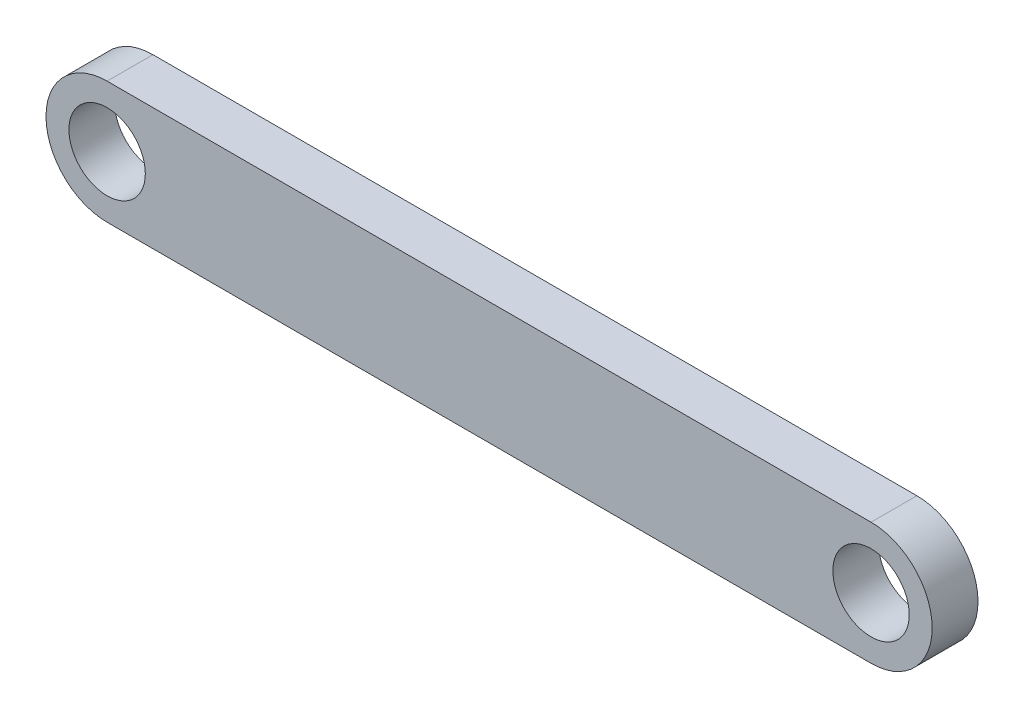
ISO-10303-21;
HEADER;
FILE_DESCRIPTION(('STEP AP214'),'2;1');
FILE_NAME('part.step','',(''),(''),'','','');
FILE_SCHEMA(('AUTOMOTIVE_DESIGN { 1 0 10303 214 1 1 1 1 }'));
ENDSEC;
DATA;
#1=APPLICATION_CONTEXT('core data for automotive mechanical design processes');
#2=APPLICATION_PROTOCOL_DEFINITION('international standard','automotive_design',2000,#1);
#3=PRODUCT_CONTEXT('',#1,'mechanical');
#4=PRODUCT('Part','Part','',(#3));
#5=PRODUCT_RELATED_PRODUCT_CATEGORY('part','',(#4));
#6=PRODUCT_DEFINITION_FORMATION('','',#4);
#7=PRODUCT_DEFINITION_CONTEXT('part definition',#1,'design');
#8=PRODUCT_DEFINITION('design','',#6,#7);
#9=PRODUCT_DEFINITION_SHAPE('','',#8);
#10=(LENGTH_UNIT() NAMED_UNIT(*) SI_UNIT(.MILLI.,.METRE.));
#11=(NAMED_UNIT(*) PLANE_ANGLE_UNIT() SI_UNIT($,.RADIAN.));
#12=(NAMED_UNIT(*) SI_UNIT($,.STERADIAN.) SOLID_ANGLE_UNIT());
#13=UNCERTAINTY_MEASURE_WITH_UNIT(LENGTH_MEASURE(1.E-05),#10,'distance_accuracy_value','');
#14=(GEOMETRIC_REPRESENTATION_CONTEXT(3) GLOBAL_UNCERTAINTY_ASSIGNED_CONTEXT((#13)) GLOBAL_UNIT_ASSIGNED_CONTEXT((#10,
#11,#12)) REPRESENTATION_CONTEXT('',''));
#15=CARTESIAN_POINT('',(0.,0.,0.));
#16=DIRECTION('',(0.,0.,1.));
#17=DIRECTION('',(1.,0.,0.));
#18=AXIS2_PLACEMENT_3D('',#15,#16,#17);
#19=CARTESIAN_POINT('',(0.,0.,3.));
#20=DIRECTION('',(0.,0.,1.));
#21=DIRECTION('',(1.,0.,0.));
#22=AXIS2_PLACEMENT_3D('',#19,#20,#21);
#23=PLANE('',#22);
#24=CARTESIAN_POINT('',(-50.,0.,3.));
#25=DIRECTION('',(0.,0.,1.));
#26=DIRECTION('',(1.,0.,0.));
#27=AXIS2_PLACEMENT_3D('',#24,#25,#26);
#28=CIRCLE('',#27,2.5);
#29=CARTESIAN_POINT('',(-47.5,0.,3.));
#30=VERTEX_POINT('',#29);
#31=EDGE_CURVE('E101',#30,#30,#28,.T.);
#32=ORIENTED_EDGE('',*,*,#31,.F.);
#33=EDGE_LOOP('',(#32));
#34=FACE_BOUND('',#33,.T.);
#35=CARTESIAN_POINT('',(0.,0.,3.));
#36=DIRECTION('',(0.,0.,1.));
#37=DIRECTION('',(1.,0.,0.));
#38=AXIS2_PLACEMENT_3D('',#35,#36,#37);
#39=CIRCLE('',#38,4.);
#40=CARTESIAN_POINT('',(0.,-4.,3.));
#41=VERTEX_POINT('',#40);
#42=CARTESIAN_POINT('',(0.,4.,3.));
#43=VERTEX_POINT('',#42);
#44=EDGE_CURVE('E86',#41,#43,#39,.T.);
#45=ORIENTED_EDGE('',*,*,#44,.T.);
#46=DIRECTION('',(-1.,0.,0.));
#47=VECTOR('',#46,1.);
#48=CARTESIAN_POINT('',(-50.,3.99999999999999,3.));
#49=LINE('',#48,#47);
#50=CARTESIAN_POINT('',(-50.,3.99999999999999,3.));
#51=VERTEX_POINT('',#50);
#52=EDGE_CURVE('E81',#43,#51,#49,.T.);
#53=ORIENTED_EDGE('',*,*,#52,.T.);
#54=CARTESIAN_POINT('',(-50.,0.,3.));
#55=DIRECTION('',(0.,0.,1.));
#56=DIRECTION('',(1.,0.,0.));
#57=AXIS2_PLACEMENT_3D('',#54,#55,#56);
#58=CIRCLE('',#57,4.);
#59=CARTESIAN_POINT('',(-50.,-4.00000000000001,3.));
#60=VERTEX_POINT('',#59);
#61=EDGE_CURVE('E84',#51,#60,#58,.T.);
#62=ORIENTED_EDGE('',*,*,#61,.T.);
#63=DIRECTION('',(1.,0.,0.));
#64=VECTOR('',#63,1.);
#65=CARTESIAN_POINT('',(-50.,-4.00000000000001,3.));
#66=LINE('',#65,#64);
#67=EDGE_CURVE('E51',#60,#41,#66,.T.);
#68=ORIENTED_EDGE('',*,*,#67,.T.);
#69=EDGE_LOOP('',(#45,#53,#62,#68));
#70=FACE_BOUND('',#69,.T.);
#71=CARTESIAN_POINT('',(0.,0.,3.));
#72=DIRECTION('',(0.,0.,1.));
#73=DIRECTION('',(1.,0.,0.));
#74=AXIS2_PLACEMENT_3D('',#71,#72,#73);
#75=CIRCLE('',#74,2.5);
#76=CARTESIAN_POINT('',(2.5,0.,3.));
#77=VERTEX_POINT('',#76);
#78=EDGE_CURVE('E116',#77,#77,#75,.T.);
#79=ORIENTED_EDGE('',*,*,#78,.F.);
#80=EDGE_LOOP('',(#79));
#81=FACE_BOUND('',#80,.T.);
#82=ADVANCED_FACE('F34',(#34,#70,#81),#23,.T.);
#83=CARTESIAN_POINT('',(0.,0.,0.));
#84=DIRECTION('',(0.,0.,1.));
#85=DIRECTION('',(1.,0.,0.));
#86=AXIS2_PLACEMENT_3D('',#83,#84,#85);
#87=PLANE('',#86);
#88=CARTESIAN_POINT('',(0.,0.,0.));
#89=DIRECTION('',(0.,0.,1.));
#90=DIRECTION('',(1.,0.,0.));
#91=AXIS2_PLACEMENT_3D('',#88,#89,#90);
#92=CIRCLE('',#91,4.);
#93=CARTESIAN_POINT('',(0.,-4.,0.));
#94=VERTEX_POINT('',#93);
#95=CARTESIAN_POINT('',(0.,4.,0.));
#96=VERTEX_POINT('',#95);
#97=EDGE_CURVE('E98',#94,#96,#92,.T.);
#98=ORIENTED_EDGE('',*,*,#97,.F.);
#99=DIRECTION('',(1.,0.,0.));
#100=VECTOR('',#99,1.);
#101=CARTESIAN_POINT('',(-50.,-4.00000000000001,0.));
#102=LINE('',#101,#100);
#103=CARTESIAN_POINT('',(-50.,-4.00000000000001,0.));
#104=VERTEX_POINT('',#103);
#105=EDGE_CURVE('E74',#104,#94,#102,.T.);
#106=ORIENTED_EDGE('',*,*,#105,.F.);
#107=CARTESIAN_POINT('',(-50.,0.,0.));
#108=DIRECTION('',(0.,0.,1.));
#109=DIRECTION('',(1.,0.,0.));
#110=AXIS2_PLACEMENT_3D('',#107,#108,#109);
#111=CIRCLE('',#110,4.);
#112=CARTESIAN_POINT('',(-50.,3.99999999999999,0.));
#113=VERTEX_POINT('',#112);
#114=EDGE_CURVE('E68',#113,#104,#111,.T.);
#115=ORIENTED_EDGE('',*,*,#114,.F.);
#116=DIRECTION('',(-1.,0.,0.));
#117=VECTOR('',#116,1.);
#118=CARTESIAN_POINT('',(-50.,3.99999999999999,0.));
#119=LINE('',#118,#117);
#120=EDGE_CURVE('E90',#96,#113,#119,.T.);
#121=ORIENTED_EDGE('',*,*,#120,.F.);
#122=EDGE_LOOP('',(#98,#106,#115,#121));
#123=FACE_BOUND('',#122,.T.);
#124=CARTESIAN_POINT('',(-50.,0.,0.));
#125=DIRECTION('',(0.,0.,1.));
#126=DIRECTION('',(1.,0.,0.));
#127=AXIS2_PLACEMENT_3D('',#124,#125,#126);
#128=CIRCLE('',#127,2.5);
#129=CARTESIAN_POINT('',(-47.5,0.,0.));
#130=VERTEX_POINT('',#129);
#131=EDGE_CURVE('E113',#130,#130,#128,.T.);
#132=ORIENTED_EDGE('',*,*,#131,.T.);
#133=EDGE_LOOP('',(#132));
#134=FACE_BOUND('',#133,.T.);
#135=CARTESIAN_POINT('',(0.,0.,0.));
#136=DIRECTION('',(0.,0.,1.));
#137=DIRECTION('',(1.,0.,0.));
#138=AXIS2_PLACEMENT_3D('',#135,#136,#137);
#139=CIRCLE('',#138,2.5);
#140=CARTESIAN_POINT('',(2.5,0.,0.));
#141=VERTEX_POINT('',#140);
#142=EDGE_CURVE('E119',#141,#141,#139,.T.);
#143=ORIENTED_EDGE('',*,*,#142,.T.);
#144=EDGE_LOOP('',(#143));
#145=FACE_BOUND('',#144,.T.);
#146=ADVANCED_FACE('F109',(#123,#134,#145),#87,.F.);
#147=CARTESIAN_POINT('',(0.,0.,3.));
#148=DIRECTION('',(0.,0.,-1.));
#149=DIRECTION('',(-1.,0.,0.));
#150=AXIS2_PLACEMENT_3D('',#147,#148,#149);
#151=CYLINDRICAL_SURFACE('',#150,4.);
#152=ORIENTED_EDGE('',*,*,#97,.T.);
#153=DIRECTION('',(0.,0.,-1.));
#154=VECTOR('',#153,1.);
#155=CARTESIAN_POINT('',(0.,4.,3.));
#156=LINE('',#155,#154);
#157=EDGE_CURVE('E11',#43,#96,#156,.T.);
#158=ORIENTED_EDGE('',*,*,#157,.F.);
#159=ORIENTED_EDGE('',*,*,#44,.F.);
#160=DIRECTION('',(0.,0.,-1.));
#161=VECTOR('',#160,1.);
#162=CARTESIAN_POINT('',(0.,-4.,3.));
#163=LINE('',#162,#161);
#164=EDGE_CURVE('E94',#41,#94,#163,.T.);
#165=ORIENTED_EDGE('',*,*,#164,.T.);
#166=EDGE_LOOP('',(#152,#158,#159,#165));
#167=FACE_BOUND('',#166,.T.);
#168=ADVANCED_FACE('F36',(#167),#151,.T.);
#169=CARTESIAN_POINT('',(-50.,3.99999999999999,3.));
#170=DIRECTION('',(0.,-1.,0.));
#171=DIRECTION('',(1.,0.,0.));
#172=AXIS2_PLACEMENT_3D('',#169,#170,#171);
#173=PLANE('',#172);
#174=ORIENTED_EDGE('',*,*,#120,.T.);
#175=DIRECTION('',(0.,0.,-1.));
#176=VECTOR('',#175,1.);
#177=CARTESIAN_POINT('',(-50.,3.99999999999999,3.));
#178=LINE('',#177,#176);
#179=EDGE_CURVE('E43',#51,#113,#178,.T.);
#180=ORIENTED_EDGE('',*,*,#179,.F.);
#181=ORIENTED_EDGE('',*,*,#52,.F.);
#182=ORIENTED_EDGE('',*,*,#157,.T.);
#183=EDGE_LOOP('',(#174,#180,#181,#182));
#184=FACE_BOUND('',#183,.T.);
#185=ADVANCED_FACE('F89',(#184),#173,.F.);
#186=CARTESIAN_POINT('',(-50.,0.,3.));
#187=DIRECTION('',(0.,0.,-1.));
#188=DIRECTION('',(-1.,0.,0.));
#189=AXIS2_PLACEMENT_3D('',#186,#187,#188);
#190=CYLINDRICAL_SURFACE('',#189,4.);
#191=ORIENTED_EDGE('',*,*,#114,.T.);
#192=DIRECTION('',(0.,0.,-1.));
#193=VECTOR('',#192,1.);
#194=CARTESIAN_POINT('',(-50.,-4.00000000000001,3.));
#195=LINE('',#194,#193);
#196=EDGE_CURVE('E91',#60,#104,#195,.T.);
#197=ORIENTED_EDGE('',*,*,#196,.F.);
#198=ORIENTED_EDGE('',*,*,#61,.F.);
#199=ORIENTED_EDGE('',*,*,#179,.T.);
#200=EDGE_LOOP('',(#191,#197,#198,#199));
#201=FACE_BOUND('',#200,.T.);
#202=ADVANCED_FACE('F92',(#201),#190,.T.);
#203=CARTESIAN_POINT('',(-50.,-4.00000000000001,3.));
#204=DIRECTION('',(0.,1.,0.));
#205=DIRECTION('',(-1.,0.,0.));
#206=AXIS2_PLACEMENT_3D('',#203,#204,#205);
#207=PLANE('',#206);
#208=ORIENTED_EDGE('',*,*,#105,.T.);
#209=ORIENTED_EDGE('',*,*,#164,.F.);
#210=ORIENTED_EDGE('',*,*,#67,.F.);
#211=ORIENTED_EDGE('',*,*,#196,.T.);
#212=EDGE_LOOP('',(#208,#209,#210,#211));
#213=FACE_BOUND('',#212,.T.);
#214=ADVANCED_FACE('F106',(#213),#207,.F.);
#215=CARTESIAN_POINT('',(-50.,0.,3.));
#216=DIRECTION('',(0.,0.,-1.));
#217=DIRECTION('',(-1.,0.,0.));
#218=AXIS2_PLACEMENT_3D('',#215,#216,#217);
#219=CYLINDRICAL_SURFACE('',#218,2.5);
#220=ORIENTED_EDGE('',*,*,#31,.T.);
#221=EDGE_LOOP('',(#220));
#222=FACE_BOUND('',#221,.T.);
#223=ORIENTED_EDGE('',*,*,#131,.F.);
#224=EDGE_LOOP('',(#223));
#225=FACE_BOUND('',#224,.T.);
#226=ADVANCED_FACE('F136',(#222,#225),#219,.F.);
#227=CARTESIAN_POINT('',(0.,0.,3.));
#228=DIRECTION('',(0.,0.,-1.));
#229=DIRECTION('',(-1.,0.,0.));
#230=AXIS2_PLACEMENT_3D('',#227,#228,#229);
#231=CYLINDRICAL_SURFACE('',#230,2.5);
#232=ORIENTED_EDGE('',*,*,#78,.T.);
#233=EDGE_LOOP('',(#232));
#234=FACE_BOUND('',#233,.T.);
#235=ORIENTED_EDGE('',*,*,#142,.F.);
#236=EDGE_LOOP('',(#235));
#237=FACE_BOUND('',#236,.T.);
#238=ADVANCED_FACE('F125',(#234,#237),#231,.F.);
#239=CLOSED_SHELL('',(#82,#146,#168,#185,#202,#214,#226,#238));
#240=MANIFOLD_SOLID_BREP('B2',#239);
#241=ADVANCED_BREP_SHAPE_REPRESENTATION('',(#18,#240),#14);
#242=SHAPE_DEFINITION_REPRESENTATION(#9,#241);
ENDSEC;
END-ISO-10303-21;
